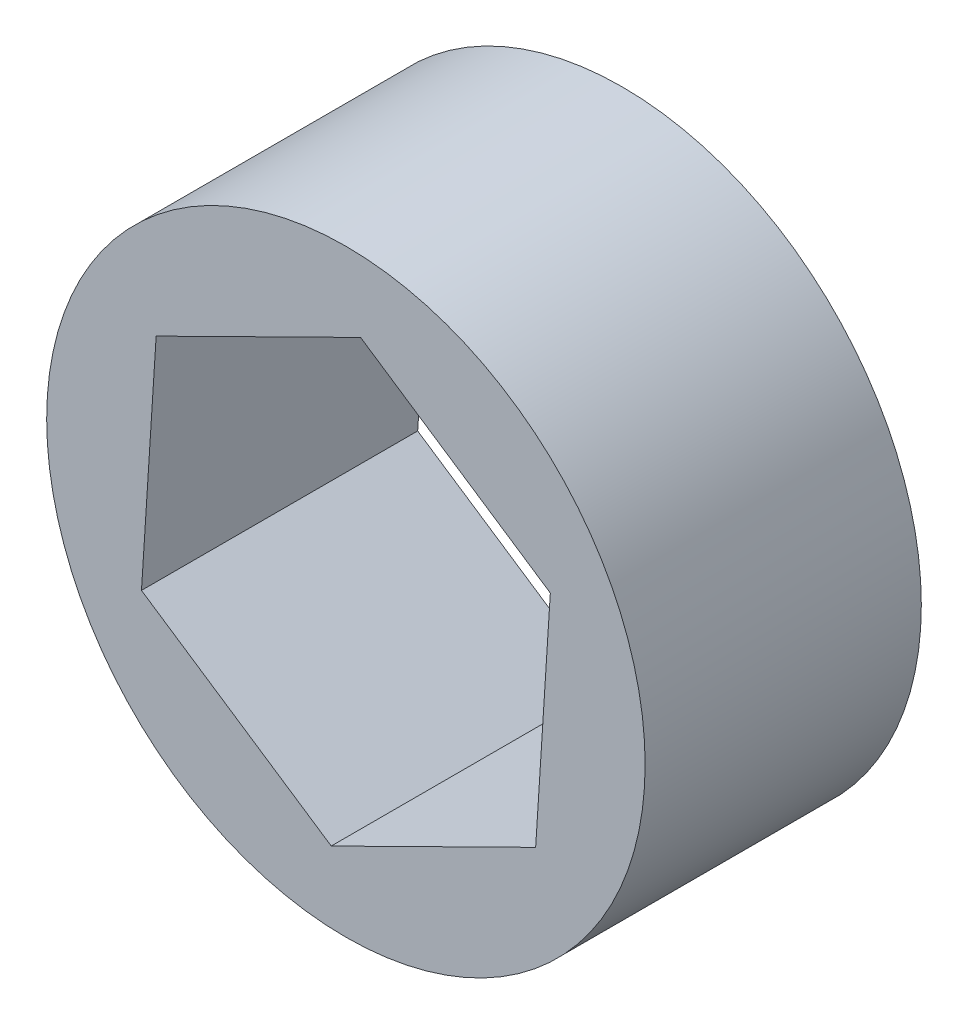
ISO-10303-21;
HEADER;
FILE_DESCRIPTION(('STEP AP214'),'2;1');
FILE_NAME('part.step','',(''),(''),'','','');
FILE_SCHEMA(('AUTOMOTIVE_DESIGN { 1 0 10303 214 1 1 1 1 }'));
ENDSEC;
DATA;
#1=APPLICATION_CONTEXT('core data for automotive mechanical design processes');
#2=APPLICATION_PROTOCOL_DEFINITION('international standard','automotive_design',2000,#1);
#3=PRODUCT_CONTEXT('',#1,'mechanical');
#4=PRODUCT('Part','Part','',(#3));
#5=PRODUCT_RELATED_PRODUCT_CATEGORY('part','',(#4));
#6=PRODUCT_DEFINITION_FORMATION('','',#4);
#7=PRODUCT_DEFINITION_CONTEXT('part definition',#1,'design');
#8=PRODUCT_DEFINITION('design','',#6,#7);
#9=PRODUCT_DEFINITION_SHAPE('','',#8);
#10=(LENGTH_UNIT() NAMED_UNIT(*) SI_UNIT(.MILLI.,.METRE.));
#11=(NAMED_UNIT(*) PLANE_ANGLE_UNIT() SI_UNIT($,.RADIAN.));
#12=(NAMED_UNIT(*) SI_UNIT($,.STERADIAN.) SOLID_ANGLE_UNIT());
#13=UNCERTAINTY_MEASURE_WITH_UNIT(LENGTH_MEASURE(1.E-05),#10,'distance_accuracy_value','');
#14=(GEOMETRIC_REPRESENTATION_CONTEXT(3) GLOBAL_UNCERTAINTY_ASSIGNED_CONTEXT((#13)) GLOBAL_UNIT_ASSIGNED_CONTEXT((#10,
#11,#12)) REPRESENTATION_CONTEXT('',''));
#15=CARTESIAN_POINT('',(0.,0.,0.));
#16=DIRECTION('',(0.,0.,1.));
#17=DIRECTION('',(1.,0.,0.));
#18=AXIS2_PLACEMENT_3D('',#15,#16,#17);
#19=CARTESIAN_POINT('',(0.,0.,9.23));
#20=DIRECTION('',(0.,0.,1.));
#21=DIRECTION('',(1.,0.,0.));
#22=AXIS2_PLACEMENT_3D('',#19,#20,#21);
#23=PLANE('',#22);
#24=CARTESIAN_POINT('',(0.,0.,9.23));
#25=DIRECTION('',(0.,0.,1.));
#26=DIRECTION('',(1.,0.,0.));
#27=AXIS2_PLACEMENT_3D('',#24,#25,#26);
#28=CIRCLE('',#27,10.);
#29=CARTESIAN_POINT('',(10.,0.,9.23));
#30=VERTEX_POINT('',#29);
#31=EDGE_CURVE('E11',#30,#30,#28,.T.);
#32=ORIENTED_EDGE('',*,*,#31,.T.);
#33=EDGE_LOOP('',(#32));
#34=FACE_BOUND('',#33,.T.);
#35=DIRECTION('',(-0.0643593142463304,-0.997926790235507,0.));
#36=VECTOR('',#35,1.);
#37=CARTESIAN_POINT('',(-6.34107489068149,4.22738326045425,9.23));
#38=LINE('',#37,#36);
#39=CARTESIAN_POINT('',(-6.34107489068149,4.22738326045425,9.23));
#40=VERTEX_POINT('',#39);
#41=CARTESIAN_POINT('',(-6.83155874042721,-3.37784031240268,9.23));
#42=VERTEX_POINT('',#41);
#43=EDGE_CURVE('E94',#40,#42,#38,.T.);
#44=ORIENTED_EDGE('',*,*,#43,.F.);
#45=DIRECTION('',(-0.896409608584179,-0.443226594010285,0.));
#46=VECTOR('',#45,1.);
#47=CARTESIAN_POINT('',(0.490483849745723,7.60522357285692,9.23));
#48=LINE('',#47,#46);
#49=CARTESIAN_POINT('',(0.490483849745723,7.60522357285692,9.23));
#50=VERTEX_POINT('',#49);
#51=EDGE_CURVE('E86',#50,#40,#48,.T.);
#52=ORIENTED_EDGE('',*,*,#51,.F.);
#53=DIRECTION('',(-0.832050294337848,0.554700196225222,0.));
#54=VECTOR('',#53,1.);
#55=CARTESIAN_POINT('',(6.83155874042721,3.37784031240268,9.23));
#56=LINE('',#55,#54);
#57=CARTESIAN_POINT('',(6.83155874042721,3.37784031240268,9.23));
#58=VERTEX_POINT('',#57);
#59=EDGE_CURVE('E114',#58,#50,#56,.T.);
#60=ORIENTED_EDGE('',*,*,#59,.F.);
#61=DIRECTION('',(0.0643593142463305,0.997926790235507,0.));
#62=VECTOR('',#61,1.);
#63=CARTESIAN_POINT('',(6.34107489068149,-4.22738326045425,9.23));
#64=LINE('',#63,#62);
#65=CARTESIAN_POINT('',(6.34107489068149,-4.22738326045425,9.23));
#66=VERTEX_POINT('',#65);
#67=EDGE_CURVE('E112',#66,#58,#64,.T.);
#68=ORIENTED_EDGE('',*,*,#67,.F.);
#69=DIRECTION('',(0.896409608584179,0.443226594010285,0.));
#70=VECTOR('',#69,1.);
#71=CARTESIAN_POINT('',(-0.490483849745719,-7.60522357285692,9.23));
#72=LINE('',#71,#70);
#73=CARTESIAN_POINT('',(-0.490483849745719,-7.60522357285692,9.23));
#74=VERTEX_POINT('',#73);
#75=EDGE_CURVE('E108',#74,#66,#72,.T.);
#76=ORIENTED_EDGE('',*,*,#75,.F.);
#77=DIRECTION('',(0.832050294337849,-0.554700196225222,0.));
#78=VECTOR('',#77,1.);
#79=CARTESIAN_POINT('',(-6.83155874042721,-3.37784031240268,9.23));
#80=LINE('',#79,#78);
#81=EDGE_CURVE('E106',#42,#74,#80,.T.);
#82=ORIENTED_EDGE('',*,*,#81,.F.);
#83=EDGE_LOOP('',(#44,#52,#60,#68,#76,#82));
#84=FACE_BOUND('',#83,.T.);
#85=ADVANCED_FACE('F33',(#34,#84),#23,.T.);
#86=CARTESIAN_POINT('',(0.,0.,0.));
#87=DIRECTION('',(0.,0.,1.));
#88=DIRECTION('',(1.,0.,0.));
#89=AXIS2_PLACEMENT_3D('',#86,#87,#88);
#90=PLANE('',#89);
#91=CARTESIAN_POINT('',(0.,0.,0.));
#92=DIRECTION('',(0.,0.,1.));
#93=DIRECTION('',(1.,0.,0.));
#94=AXIS2_PLACEMENT_3D('',#91,#92,#93);
#95=CIRCLE('',#94,10.);
#96=CARTESIAN_POINT('',(10.,0.,0.));
#97=VERTEX_POINT('',#96);
#98=EDGE_CURVE('E37',#97,#97,#95,.T.);
#99=ORIENTED_EDGE('',*,*,#98,.F.);
#100=EDGE_LOOP('',(#99));
#101=FACE_BOUND('',#100,.T.);
#102=DIRECTION('',(-0.896409608584179,-0.443226594010285,0.));
#103=VECTOR('',#102,1.);
#104=CARTESIAN_POINT('',(0.490483849745723,7.60522357285692,0.));
#105=LINE('',#104,#103);
#106=CARTESIAN_POINT('',(0.490483849745723,7.60522357285693,0.));
#107=VERTEX_POINT('',#106);
#108=CARTESIAN_POINT('',(-6.34107489068149,4.22738326045425,0.));
#109=VERTEX_POINT('',#108);
#110=EDGE_CURVE('E56',#107,#109,#105,.T.);
#111=ORIENTED_EDGE('',*,*,#110,.T.);
#112=DIRECTION('',(-0.0643593142463304,-0.997926790235507,0.));
#113=VECTOR('',#112,1.);
#114=CARTESIAN_POINT('',(-6.34107489068149,4.22738326045425,0.));
#115=LINE('',#114,#113);
#116=CARTESIAN_POINT('',(-6.83155874042721,-3.37784031240268,0.));
#117=VERTEX_POINT('',#116);
#118=EDGE_CURVE('E101',#109,#117,#115,.T.);
#119=ORIENTED_EDGE('',*,*,#118,.T.);
#120=DIRECTION('',(0.832050294337849,-0.554700196225222,0.));
#121=VECTOR('',#120,1.);
#122=CARTESIAN_POINT('',(-6.83155874042721,-3.37784031240268,0.));
#123=LINE('',#122,#121);
#124=CARTESIAN_POINT('',(-0.490483849745719,-7.60522357285692,0.));
#125=VERTEX_POINT('',#124);
#126=EDGE_CURVE('E118',#117,#125,#123,.T.);
#127=ORIENTED_EDGE('',*,*,#126,.T.);
#128=DIRECTION('',(0.896409608584179,0.443226594010285,0.));
#129=VECTOR('',#128,1.);
#130=CARTESIAN_POINT('',(-0.490483849745719,-7.60522357285692,0.));
#131=LINE('',#130,#129);
#132=CARTESIAN_POINT('',(6.34107489068149,-4.22738326045425,0.));
#133=VERTEX_POINT('',#132);
#134=EDGE_CURVE('E121',#125,#133,#131,.T.);
#135=ORIENTED_EDGE('',*,*,#134,.T.);
#136=DIRECTION('',(0.0643593142463305,0.997926790235507,0.));
#137=VECTOR('',#136,1.);
#138=CARTESIAN_POINT('',(6.34107489068149,-4.22738326045425,0.));
#139=LINE('',#138,#137);
#140=CARTESIAN_POINT('',(6.83155874042721,3.37784031240268,0.));
#141=VERTEX_POINT('',#140);
#142=EDGE_CURVE('E124',#133,#141,#139,.T.);
#143=ORIENTED_EDGE('',*,*,#142,.T.);
#144=DIRECTION('',(-0.832050294337848,0.554700196225222,0.));
#145=VECTOR('',#144,1.);
#146=CARTESIAN_POINT('',(6.83155874042721,3.37784031240268,0.));
#147=LINE('',#146,#145);
#148=EDGE_CURVE('E95',#141,#107,#147,.T.);
#149=ORIENTED_EDGE('',*,*,#148,.T.);
#150=EDGE_LOOP('',(#111,#119,#127,#135,#143,#149));
#151=FACE_BOUND('',#150,.T.);
#152=ADVANCED_FACE('F141',(#101,#151),#90,.F.);
#153=CARTESIAN_POINT('',(0.,0.,9.23));
#154=DIRECTION('',(0.,0.,-1.));
#155=DIRECTION('',(-1.,0.,0.));
#156=AXIS2_PLACEMENT_3D('',#153,#154,#155);
#157=CYLINDRICAL_SURFACE('',#156,10.);
#158=ORIENTED_EDGE('',*,*,#31,.F.);
#159=EDGE_LOOP('',(#158));
#160=FACE_BOUND('',#159,.T.);
#161=ORIENTED_EDGE('',*,*,#98,.T.);
#162=EDGE_LOOP('',(#161));
#163=FACE_BOUND('',#162,.T.);
#164=ADVANCED_FACE('F35',(#160,#163),#157,.T.);
#165=CARTESIAN_POINT('',(0.490483849745723,7.60522357285692,9.23));
#166=DIRECTION('',(0.443226594010285,-0.896409608584179,0.));
#167=DIRECTION('',(0.89640960858418,0.443226594010285,0.));
#168=AXIS2_PLACEMENT_3D('',#165,#166,#167);
#169=PLANE('',#168);
#170=ORIENTED_EDGE('',*,*,#110,.F.);
#171=DIRECTION('',(0.,0.,-1.));
#172=VECTOR('',#171,1.);
#173=CARTESIAN_POINT('',(0.490483849745723,7.60522357285692,9.23));
#174=LINE('',#173,#172);
#175=EDGE_CURVE('E90',#50,#107,#174,.T.);
#176=ORIENTED_EDGE('',*,*,#175,.F.);
#177=ORIENTED_EDGE('',*,*,#51,.T.);
#178=DIRECTION('',(0.,0.,-1.));
#179=VECTOR('',#178,1.);
#180=CARTESIAN_POINT('',(-6.34107489068149,4.22738326045425,9.23));
#181=LINE('',#180,#179);
#182=EDGE_CURVE('E89',#40,#109,#181,.T.);
#183=ORIENTED_EDGE('',*,*,#182,.T.);
#184=EDGE_LOOP('',(#170,#176,#177,#183));
#185=FACE_BOUND('',#184,.T.);
#186=ADVANCED_FACE('F88',(#185),#169,.T.);
#187=CARTESIAN_POINT('',(-6.34107489068149,4.22738326045425,9.23));
#188=DIRECTION('',(0.997926790235507,-0.0643593142463304,0.));
#189=DIRECTION('',(0.0643593142463304,0.997926790235507,0.));
#190=AXIS2_PLACEMENT_3D('',#187,#188,#189);
#191=PLANE('',#190);
#192=ORIENTED_EDGE('',*,*,#118,.F.);
#193=ORIENTED_EDGE('',*,*,#182,.F.);
#194=ORIENTED_EDGE('',*,*,#43,.T.);
#195=DIRECTION('',(0.,0.,-1.));
#196=VECTOR('',#195,1.);
#197=CARTESIAN_POINT('',(-6.83155874042721,-3.37784031240268,9.23));
#198=LINE('',#197,#196);
#199=EDGE_CURVE('E102',#42,#117,#198,.T.);
#200=ORIENTED_EDGE('',*,*,#199,.T.);
#201=EDGE_LOOP('',(#192,#193,#194,#200));
#202=FACE_BOUND('',#201,.T.);
#203=ADVANCED_FACE('F98',(#202),#191,.T.);
#204=CARTESIAN_POINT('',(-6.83155874042721,-3.37784031240268,9.23));
#205=DIRECTION('',(0.554700196225222,0.832050294337849,0.));
#206=DIRECTION('',(-0.832050294337849,0.554700196225222,0.));
#207=AXIS2_PLACEMENT_3D('',#204,#205,#206);
#208=PLANE('',#207);
#209=ORIENTED_EDGE('',*,*,#126,.F.);
#210=ORIENTED_EDGE('',*,*,#199,.F.);
#211=ORIENTED_EDGE('',*,*,#81,.T.);
#212=DIRECTION('',(0.,0.,-1.));
#213=VECTOR('',#212,1.);
#214=CARTESIAN_POINT('',(-0.490483849745719,-7.60522357285692,9.23));
#215=LINE('',#214,#213);
#216=EDGE_CURVE('E133',#74,#125,#215,.T.);
#217=ORIENTED_EDGE('',*,*,#216,.T.);
#218=EDGE_LOOP('',(#209,#210,#211,#217));
#219=FACE_BOUND('',#218,.T.);
#220=ADVANCED_FACE('F137',(#219),#208,.T.);
#221=CARTESIAN_POINT('',(-0.490483849745719,-7.60522357285692,9.23));
#222=DIRECTION('',(-0.443226594010285,0.896409608584179,0.));
#223=DIRECTION('',(-0.89640960858418,-0.443226594010285,0.));
#224=AXIS2_PLACEMENT_3D('',#221,#222,#223);
#225=PLANE('',#224);
#226=ORIENTED_EDGE('',*,*,#134,.F.);
#227=ORIENTED_EDGE('',*,*,#216,.F.);
#228=ORIENTED_EDGE('',*,*,#75,.T.);
#229=DIRECTION('',(0.,0.,-1.));
#230=VECTOR('',#229,1.);
#231=CARTESIAN_POINT('',(6.34107489068149,-4.22738326045425,9.23));
#232=LINE('',#231,#230);
#233=EDGE_CURVE('E131',#66,#133,#232,.T.);
#234=ORIENTED_EDGE('',*,*,#233,.T.);
#235=EDGE_LOOP('',(#226,#227,#228,#234));
#236=FACE_BOUND('',#235,.T.);
#237=ADVANCED_FACE('F149',(#236),#225,.T.);
#238=CARTESIAN_POINT('',(6.34107489068149,-4.22738326045425,9.23));
#239=DIRECTION('',(-0.997926790235507,0.0643593142463305,0.));
#240=DIRECTION('',(-0.0643593142463305,-0.997926790235507,0.));
#241=AXIS2_PLACEMENT_3D('',#238,#239,#240);
#242=PLANE('',#241);
#243=ORIENTED_EDGE('',*,*,#142,.F.);
#244=ORIENTED_EDGE('',*,*,#233,.F.);
#245=ORIENTED_EDGE('',*,*,#67,.T.);
#246=DIRECTION('',(0.,0.,-1.));
#247=VECTOR('',#246,1.);
#248=CARTESIAN_POINT('',(6.83155874042721,3.37784031240268,9.23));
#249=LINE('',#248,#247);
#250=EDGE_CURVE('E48',#58,#141,#249,.T.);
#251=ORIENTED_EDGE('',*,*,#250,.T.);
#252=EDGE_LOOP('',(#243,#244,#245,#251));
#253=FACE_BOUND('',#252,.T.);
#254=ADVANCED_FACE('F147',(#253),#242,.T.);
#255=CARTESIAN_POINT('',(6.83155874042721,3.37784031240268,9.23));
#256=DIRECTION('',(-0.554700196225222,-0.832050294337848,0.));
#257=DIRECTION('',(0.832050294337848,-0.554700196225222,0.));
#258=AXIS2_PLACEMENT_3D('',#255,#256,#257);
#259=PLANE('',#258);
#260=ORIENTED_EDGE('',*,*,#148,.F.);
#261=ORIENTED_EDGE('',*,*,#250,.F.);
#262=ORIENTED_EDGE('',*,*,#59,.T.);
#263=ORIENTED_EDGE('',*,*,#175,.T.);
#264=EDGE_LOOP('',(#260,#261,#262,#263));
#265=FACE_BOUND('',#264,.T.);
#266=ADVANCED_FACE('F143',(#265),#259,.T.);
#267=CLOSED_SHELL('',(#85,#152,#164,#186,#203,#220,#237,#254,#266));
#268=MANIFOLD_SOLID_BREP('B2',#267);
#269=ADVANCED_BREP_SHAPE_REPRESENTATION('',(#18,#268),#14);
#270=SHAPE_DEFINITION_REPRESENTATION(#9,#269);
ENDSEC;
END-ISO-10303-21;
